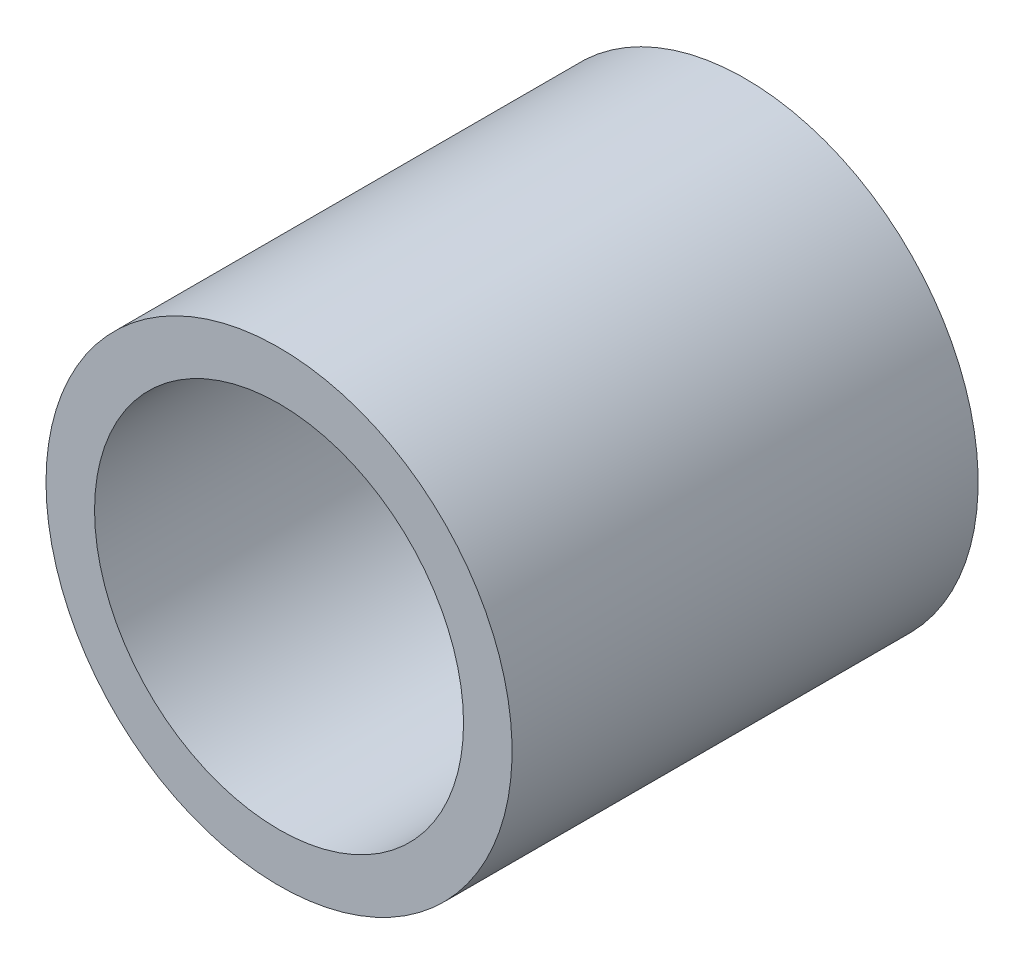
ISO-10303-21;
HEADER;
FILE_DESCRIPTION(('STEP AP214'),'2;1');
FILE_NAME('part.step','',(''),(''),'','','');
FILE_SCHEMA(('AUTOMOTIVE_DESIGN { 1 0 10303 214 1 1 1 1 }'));
ENDSEC;
DATA;
#1=APPLICATION_CONTEXT('core data for automotive mechanical design processes');
#2=APPLICATION_PROTOCOL_DEFINITION('international standard','automotive_design',2000,#1);
#3=PRODUCT_CONTEXT('',#1,'mechanical');
#4=PRODUCT('Part','Part','',(#3));
#5=PRODUCT_RELATED_PRODUCT_CATEGORY('part','',(#4));
#6=PRODUCT_DEFINITION_FORMATION('','',#4);
#7=PRODUCT_DEFINITION_CONTEXT('part definition',#1,'design');
#8=PRODUCT_DEFINITION('design','',#6,#7);
#9=PRODUCT_DEFINITION_SHAPE('','',#8);
#10=(LENGTH_UNIT() NAMED_UNIT(*) SI_UNIT(.MILLI.,.METRE.));
#11=(NAMED_UNIT(*) PLANE_ANGLE_UNIT() SI_UNIT($,.RADIAN.));
#12=(NAMED_UNIT(*) SI_UNIT($,.STERADIAN.) SOLID_ANGLE_UNIT());
#13=UNCERTAINTY_MEASURE_WITH_UNIT(LENGTH_MEASURE(1.E-05),#10,'distance_accuracy_value','');
#14=(GEOMETRIC_REPRESENTATION_CONTEXT(3) GLOBAL_UNCERTAINTY_ASSIGNED_CONTEXT((#13)) GLOBAL_UNIT_ASSIGNED_CONTEXT((#10,
#11,#12)) REPRESENTATION_CONTEXT('',''));
#15=CARTESIAN_POINT('',(0.,0.,0.));
#16=DIRECTION('',(0.,0.,1.));
#17=DIRECTION('',(1.,0.,0.));
#18=AXIS2_PLACEMENT_3D('',#15,#16,#17);
#19=CARTESIAN_POINT('',(0.,0.,9.525));
#20=DIRECTION('',(0.,0.,1.));
#21=DIRECTION('',(1.,0.,0.));
#22=AXIS2_PLACEMENT_3D('',#19,#20,#21);
#23=PLANE('',#22);
#24=CARTESIAN_POINT('',(0.,0.,9.525));
#25=DIRECTION('',(0.,0.,1.));
#26=DIRECTION('',(1.,0.,0.));
#27=AXIS2_PLACEMENT_3D('',#24,#25,#26);
#28=CIRCLE('',#27,9.525);
#29=CARTESIAN_POINT('',(-9.525,0.,9.525));
#30=VERTEX_POINT('',#29);
#31=EDGE_CURVE('E10',#30,#30,#28,.T.);
#32=ORIENTED_EDGE('',*,*,#31,.T.);
#33=EDGE_LOOP('',(#32));
#34=FACE_BOUND('',#33,.T.);
#35=CARTESIAN_POINT('',(0.,0.,9.525));
#36=DIRECTION('',(0.,0.,1.));
#37=DIRECTION('',(1.,0.,0.));
#38=AXIS2_PLACEMENT_3D('',#35,#36,#37);
#39=CIRCLE('',#38,7.540625);
#40=CARTESIAN_POINT('',(-7.540625,0.,9.525));
#41=VERTEX_POINT('',#40);
#42=EDGE_CURVE('E41',#41,#41,#39,.T.);
#43=ORIENTED_EDGE('',*,*,#42,.F.);
#44=EDGE_LOOP('',(#43));
#45=FACE_BOUND('',#44,.T.);
#46=ADVANCED_FACE('F30',(#34,#45),#23,.T.);
#47=CARTESIAN_POINT('',(0.,0.,-9.525));
#48=DIRECTION('',(0.,0.,1.));
#49=DIRECTION('',(1.,0.,0.));
#50=AXIS2_PLACEMENT_3D('',#47,#48,#49);
#51=PLANE('',#50);
#52=CARTESIAN_POINT('',(0.,0.,-9.525));
#53=DIRECTION('',(0.,0.,1.));
#54=DIRECTION('',(1.,0.,0.));
#55=AXIS2_PLACEMENT_3D('',#52,#53,#54);
#56=CIRCLE('',#55,9.525);
#57=CARTESIAN_POINT('',(-9.525,0.,-9.525));
#58=VERTEX_POINT('',#57);
#59=EDGE_CURVE('E34',#58,#58,#56,.T.);
#60=ORIENTED_EDGE('',*,*,#59,.F.);
#61=EDGE_LOOP('',(#60));
#62=FACE_BOUND('',#61,.T.);
#63=CARTESIAN_POINT('',(0.,0.,-9.525));
#64=DIRECTION('',(0.,0.,1.));
#65=DIRECTION('',(1.,0.,0.));
#66=AXIS2_PLACEMENT_3D('',#63,#64,#65);
#67=CIRCLE('',#66,7.540625);
#68=CARTESIAN_POINT('',(-7.540625,0.,-9.525));
#69=VERTEX_POINT('',#68);
#70=EDGE_CURVE('E43',#69,#69,#67,.T.);
#71=ORIENTED_EDGE('',*,*,#70,.T.);
#72=EDGE_LOOP('',(#71));
#73=FACE_BOUND('',#72,.T.);
#74=ADVANCED_FACE('F53',(#62,#73),#51,.F.);
#75=CARTESIAN_POINT('',(0.,0.,9.525));
#76=DIRECTION('',(0.,0.,-1.));
#77=DIRECTION('',(-1.,0.,0.));
#78=AXIS2_PLACEMENT_3D('',#75,#76,#77);
#79=CYLINDRICAL_SURFACE('',#78,9.525);
#80=CARTESIAN_POINT('',(-9.525,0.,9.525));
#81=CARTESIAN_POINT('',(-9.525,0.,9.3265625));
#82=CARTESIAN_POINT('',(-9.525,0.,9.128125));
#83=CARTESIAN_POINT('',(-9.525,0.,8.73125));
#84=CARTESIAN_POINT('',(-9.525,0.,8.5328125));
#85=CARTESIAN_POINT('',(-9.525,0.,8.1359375));
#86=CARTESIAN_POINT('',(-9.525,0.,7.9375));
#87=CARTESIAN_POINT('',(-9.525,0.,7.540625));
#88=CARTESIAN_POINT('',(-9.525,0.,7.3421875));
#89=CARTESIAN_POINT('',(-9.525,0.,6.9453125));
#90=CARTESIAN_POINT('',(-9.525,0.,6.746875));
#91=CARTESIAN_POINT('',(-9.525,0.,6.35));
#92=CARTESIAN_POINT('',(-9.525,0.,6.1515625));
#93=CARTESIAN_POINT('',(-9.525,0.,5.7546875));
#94=CARTESIAN_POINT('',(-9.525,0.,5.55625));
#95=CARTESIAN_POINT('',(-9.525,0.,5.159375));
#96=CARTESIAN_POINT('',(-9.525,0.,4.9609375));
#97=CARTESIAN_POINT('',(-9.525,0.,4.5640625));
#98=CARTESIAN_POINT('',(-9.525,0.,4.365625));
#99=CARTESIAN_POINT('',(-9.525,0.,3.96875));
#100=CARTESIAN_POINT('',(-9.525,0.,3.7703125));
#101=CARTESIAN_POINT('',(-9.525,0.,3.3734375));
#102=CARTESIAN_POINT('',(-9.525,0.,3.175));
#103=CARTESIAN_POINT('',(-9.525,0.,2.778125));
#104=CARTESIAN_POINT('',(-9.525,0.,2.5796875));
#105=CARTESIAN_POINT('',(-9.525,0.,2.1828125));
#106=CARTESIAN_POINT('',(-9.525,0.,1.984375));
#107=CARTESIAN_POINT('',(-9.525,0.,1.5875));
#108=CARTESIAN_POINT('',(-9.525,0.,1.3890625));
#109=CARTESIAN_POINT('',(-9.525,0.,0.992187500000001));
#110=CARTESIAN_POINT('',(-9.525,0.,0.793750000000001));
#111=CARTESIAN_POINT('',(-9.525,0.,0.396875));
#112=CARTESIAN_POINT('',(-9.525,0.,0.1984375));
#113=CARTESIAN_POINT('',(-9.525,0.,-0.1984375));
#114=CARTESIAN_POINT('',(-9.525,0.,-0.396875));
#115=CARTESIAN_POINT('',(-9.525,0.,-0.793750000000001));
#116=CARTESIAN_POINT('',(-9.525,0.,-0.992187500000001));
#117=CARTESIAN_POINT('',(-9.525,0.,-1.3890625));
#118=CARTESIAN_POINT('',(-9.525,0.,-1.5875));
#119=CARTESIAN_POINT('',(-9.525,0.,-1.984375));
#120=CARTESIAN_POINT('',(-9.525,0.,-2.1828125));
#121=CARTESIAN_POINT('',(-9.525,0.,-2.5796875));
#122=CARTESIAN_POINT('',(-9.525,0.,-2.778125));
#123=CARTESIAN_POINT('',(-9.525,0.,-3.175));
#124=CARTESIAN_POINT('',(-9.525,0.,-3.3734375));
#125=CARTESIAN_POINT('',(-9.525,0.,-3.7703125));
#126=CARTESIAN_POINT('',(-9.525,0.,-3.96875));
#127=CARTESIAN_POINT('',(-9.525,0.,-4.365625));
#128=CARTESIAN_POINT('',(-9.525,0.,-4.5640625));
#129=CARTESIAN_POINT('',(-9.525,0.,-4.9609375));
#130=CARTESIAN_POINT('',(-9.525,0.,-5.159375));
#131=CARTESIAN_POINT('',(-9.525,0.,-5.55625));
#132=CARTESIAN_POINT('',(-9.525,0.,-5.7546875));
#133=CARTESIAN_POINT('',(-9.525,0.,-6.1515625));
#134=CARTESIAN_POINT('',(-9.525,0.,-6.35));
#135=CARTESIAN_POINT('',(-9.525,0.,-6.746875));
#136=CARTESIAN_POINT('',(-9.525,0.,-6.9453125));
#137=CARTESIAN_POINT('',(-9.525,0.,-7.3421875));
#138=CARTESIAN_POINT('',(-9.525,0.,-7.540625));
#139=CARTESIAN_POINT('',(-9.525,0.,-7.9375));
#140=CARTESIAN_POINT('',(-9.525,0.,-8.1359375));
#141=CARTESIAN_POINT('',(-9.525,0.,-8.5328125));
#142=CARTESIAN_POINT('',(-9.525,0.,-8.73125));
#143=CARTESIAN_POINT('',(-9.525,0.,-9.128125));
#144=CARTESIAN_POINT('',(-9.525,0.,-9.3265625));
#145=CARTESIAN_POINT('',(-9.525,0.,-9.525));
#146=B_SPLINE_CURVE_WITH_KNOTS('',3,(#80,#81,#82,#83,#84,#85,#86,#87,#88,#89,#90,#91,#92,#93,
#94,#95,#96,#97,#98,#99,#100,#101,#102,#103,#104,#105,#106,#107,#108,#109,#110,#111,#112,#113,
#114,#115,#116,#117,#118,#119,#120,#121,#122,#123,#124,#125,#126,#127,#128,#129,#130,#131,#132,
#133,#134,#135,#136,#137,#138,#139,#140,#141,#142,#143,#144,#145),.UNSPECIFIED.,.F.,.F.,(4,2,2,
2,2,2,2,2,2,2,2,2,2,2,2,2,2,2,2,2,2,2,2,2,2,2,2,2,2,2,2,2,4),(0.,0.5953125,1.190625,1.7859375,
2.38125,2.9765625,3.571875,4.1671875,4.7625,5.3578125,5.953125,6.5484375,7.14375,7.7390625,
8.334375,8.9296875,9.525,10.1203125,10.715625,11.3109375,11.90625,12.5015625,13.096875,
13.6921875,14.2875,14.8828125,15.478125,16.0734375,16.66875,17.2640625,17.859375,18.4546875,
19.05),.UNSPECIFIED.);
#147=EDGE_CURVE('BSEAM32',#30,#58,#146,.T.);
#148=ORIENTED_EDGE('',*,*,#31,.F.);
#149=ORIENTED_EDGE('',*,*,#59,.T.);
#150=ORIENTED_EDGE('',*,*,#147,.T.);
#151=ORIENTED_EDGE('',*,*,#147,.F.);
#152=EDGE_LOOP('',(#148,#150,#149,#151));
#153=FACE_BOUND('',#152,.T.);
#154=ADVANCED_FACE('F32',(#153),#79,.T.);
#155=CARTESIAN_POINT('',(0.,0.,9.525));
#156=DIRECTION('',(0.,0.,-1.));
#157=DIRECTION('',(-1.,0.,0.));
#158=AXIS2_PLACEMENT_3D('',#155,#156,#157);
#159=CYLINDRICAL_SURFACE('',#158,7.540625);
#160=CARTESIAN_POINT('',(-7.540625,0.,9.525));
#161=CARTESIAN_POINT('',(-7.540625,0.,9.3265625));
#162=CARTESIAN_POINT('',(-7.540625,0.,9.128125));
#163=CARTESIAN_POINT('',(-7.540625,0.,8.73125));
#164=CARTESIAN_POINT('',(-7.540625,0.,8.5328125));
#165=CARTESIAN_POINT('',(-7.540625,0.,8.1359375));
#166=CARTESIAN_POINT('',(-7.540625,0.,7.9375));
#167=CARTESIAN_POINT('',(-7.540625,0.,7.540625));
#168=CARTESIAN_POINT('',(-7.540625,0.,7.3421875));
#169=CARTESIAN_POINT('',(-7.540625,0.,6.9453125));
#170=CARTESIAN_POINT('',(-7.540625,0.,6.746875));
#171=CARTESIAN_POINT('',(-7.540625,0.,6.35));
#172=CARTESIAN_POINT('',(-7.540625,0.,6.1515625));
#173=CARTESIAN_POINT('',(-7.540625,0.,5.7546875));
#174=CARTESIAN_POINT('',(-7.540625,0.,5.55625));
#175=CARTESIAN_POINT('',(-7.540625,0.,5.159375));
#176=CARTESIAN_POINT('',(-7.540625,0.,4.9609375));
#177=CARTESIAN_POINT('',(-7.540625,0.,4.5640625));
#178=CARTESIAN_POINT('',(-7.540625,0.,4.365625));
#179=CARTESIAN_POINT('',(-7.540625,0.,3.96875));
#180=CARTESIAN_POINT('',(-7.540625,0.,3.7703125));
#181=CARTESIAN_POINT('',(-7.540625,0.,3.3734375));
#182=CARTESIAN_POINT('',(-7.540625,0.,3.175));
#183=CARTESIAN_POINT('',(-7.540625,0.,2.778125));
#184=CARTESIAN_POINT('',(-7.540625,0.,2.5796875));
#185=CARTESIAN_POINT('',(-7.540625,0.,2.1828125));
#186=CARTESIAN_POINT('',(-7.540625,0.,1.984375));
#187=CARTESIAN_POINT('',(-7.540625,0.,1.5875));
#188=CARTESIAN_POINT('',(-7.540625,0.,1.3890625));
#189=CARTESIAN_POINT('',(-7.540625,0.,0.992187500000001));
#190=CARTESIAN_POINT('',(-7.540625,0.,0.793750000000001));
#191=CARTESIAN_POINT('',(-7.540625,0.,0.396875));
#192=CARTESIAN_POINT('',(-7.540625,0.,0.1984375));
#193=CARTESIAN_POINT('',(-7.540625,0.,-0.1984375));
#194=CARTESIAN_POINT('',(-7.540625,0.,-0.396875));
#195=CARTESIAN_POINT('',(-7.540625,0.,-0.793750000000001));
#196=CARTESIAN_POINT('',(-7.540625,0.,-0.992187500000001));
#197=CARTESIAN_POINT('',(-7.540625,0.,-1.3890625));
#198=CARTESIAN_POINT('',(-7.540625,0.,-1.5875));
#199=CARTESIAN_POINT('',(-7.540625,0.,-1.984375));
#200=CARTESIAN_POINT('',(-7.540625,0.,-2.1828125));
#201=CARTESIAN_POINT('',(-7.540625,0.,-2.5796875));
#202=CARTESIAN_POINT('',(-7.540625,0.,-2.778125));
#203=CARTESIAN_POINT('',(-7.540625,0.,-3.175));
#204=CARTESIAN_POINT('',(-7.540625,0.,-3.3734375));
#205=CARTESIAN_POINT('',(-7.540625,0.,-3.7703125));
#206=CARTESIAN_POINT('',(-7.540625,0.,-3.96875));
#207=CARTESIAN_POINT('',(-7.540625,0.,-4.365625));
#208=CARTESIAN_POINT('',(-7.540625,0.,-4.5640625));
#209=CARTESIAN_POINT('',(-7.540625,0.,-4.9609375));
#210=CARTESIAN_POINT('',(-7.540625,0.,-5.159375));
#211=CARTESIAN_POINT('',(-7.540625,0.,-5.55625));
#212=CARTESIAN_POINT('',(-7.540625,0.,-5.7546875));
#213=CARTESIAN_POINT('',(-7.540625,0.,-6.1515625));
#214=CARTESIAN_POINT('',(-7.540625,0.,-6.35));
#215=CARTESIAN_POINT('',(-7.540625,0.,-6.746875));
#216=CARTESIAN_POINT('',(-7.540625,0.,-6.9453125));
#217=CARTESIAN_POINT('',(-7.540625,0.,-7.3421875));
#218=CARTESIAN_POINT('',(-7.540625,0.,-7.540625));
#219=CARTESIAN_POINT('',(-7.540625,0.,-7.9375));
#220=CARTESIAN_POINT('',(-7.540625,0.,-8.1359375));
#221=CARTESIAN_POINT('',(-7.540625,0.,-8.5328125));
#222=CARTESIAN_POINT('',(-7.540625,0.,-8.73125));
#223=CARTESIAN_POINT('',(-7.540625,0.,-9.128125));
#224=CARTESIAN_POINT('',(-7.540625,0.,-9.3265625));
#225=CARTESIAN_POINT('',(-7.540625,0.,-9.525));
#226=B_SPLINE_CURVE_WITH_KNOTS('',3,(#160,#161,#162,#163,#164,#165,#166,#167,#168,#169,#170,
#171,#172,#173,#174,#175,#176,#177,#178,#179,#180,#181,#182,#183,#184,#185,#186,#187,#188,#189,
#190,#191,#192,#193,#194,#195,#196,#197,#198,#199,#200,#201,#202,#203,#204,#205,#206,#207,#208,
#209,#210,#211,#212,#213,#214,#215,#216,#217,#218,#219,#220,#221,#222,#223,#224,#225),
.UNSPECIFIED.,.F.,.F.,(4,2,2,2,2,2,2,2,2,2,2,2,2,2,2,2,2,2,2,2,2,2,2,2,2,2,2,2,2,2,2,2,4),(0.,
0.5953125,1.190625,1.7859375,2.38125,2.9765625,3.571875,4.1671875,4.7625,5.3578125,5.953125,
6.5484375,7.14375,7.7390625,8.334375,8.9296875,9.525,10.1203125,10.715625,11.3109375,11.90625,
12.5015625,13.096875,13.6921875,14.2875,14.8828125,15.478125,16.0734375,16.66875,17.2640625,
17.859375,18.4546875,19.05),.UNSPECIFIED.);
#227=EDGE_CURVE('BSEAM49',#41,#69,#226,.T.);
#228=ORIENTED_EDGE('',*,*,#42,.T.);
#229=ORIENTED_EDGE('',*,*,#70,.F.);
#230=ORIENTED_EDGE('',*,*,#227,.T.);
#231=ORIENTED_EDGE('',*,*,#227,.F.);
#232=EDGE_LOOP('',(#228,#230,#229,#231));
#233=FACE_BOUND('',#232,.T.);
#234=ADVANCED_FACE('F49',(#233),#159,.F.);
#235=CLOSED_SHELL('',(#46,#74,#154,#234));
#236=MANIFOLD_SOLID_BREP('B2',#235);
#237=ADVANCED_BREP_SHAPE_REPRESENTATION('',(#18,#236),#14);
#238=SHAPE_DEFINITION_REPRESENTATION(#9,#237);
ENDSEC;
END-ISO-10303-21;
